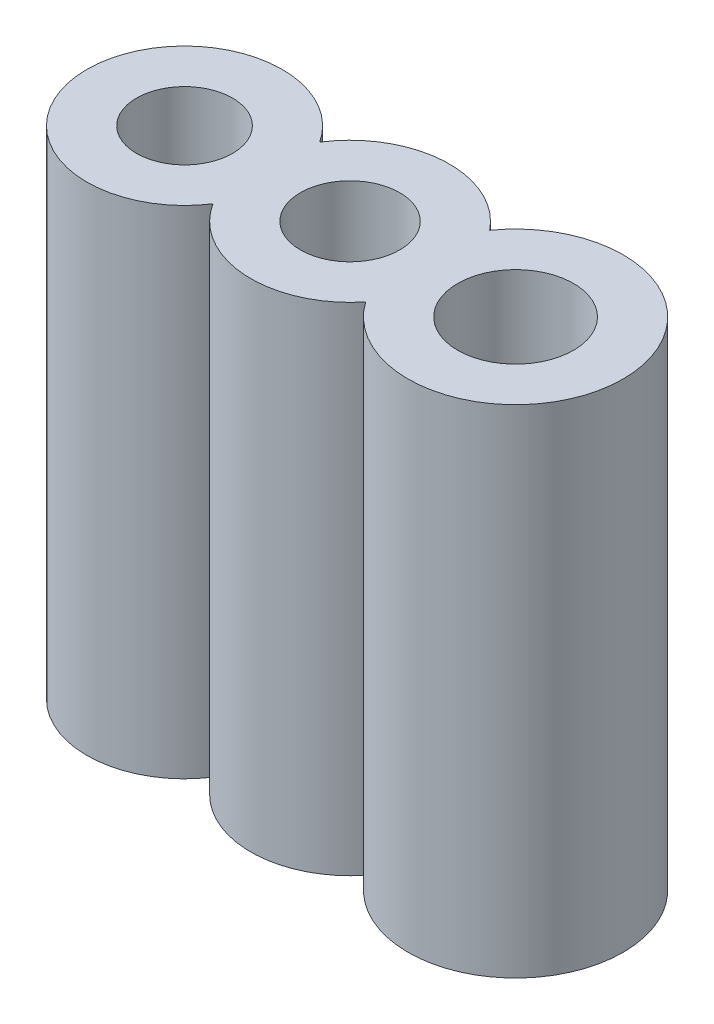
ISO-10303-21;
HEADER;
FILE_DESCRIPTION(('STEP AP214'),'2;1');
FILE_NAME('part.step','',(''),(''),'','','');
FILE_SCHEMA(('AUTOMOTIVE_DESIGN { 1 0 10303 214 1 1 1 1 }'));
ENDSEC;
DATA;
#1=APPLICATION_CONTEXT('core data for automotive mechanical design processes');
#2=APPLICATION_PROTOCOL_DEFINITION('international standard','automotive_design',2000,#1);
#3=PRODUCT_CONTEXT('',#1,'mechanical');
#4=PRODUCT('Part','Part','',(#3));
#5=PRODUCT_RELATED_PRODUCT_CATEGORY('part','',(#4));
#6=PRODUCT_DEFINITION_FORMATION('','',#4);
#7=PRODUCT_DEFINITION_CONTEXT('part definition',#1,'design');
#8=PRODUCT_DEFINITION('design','',#6,#7);
#9=PRODUCT_DEFINITION_SHAPE('','',#8);
#10=(LENGTH_UNIT() NAMED_UNIT(*) SI_UNIT(.MILLI.,.METRE.));
#11=(NAMED_UNIT(*) PLANE_ANGLE_UNIT() SI_UNIT($,.RADIAN.));
#12=(NAMED_UNIT(*) SI_UNIT($,.STERADIAN.) SOLID_ANGLE_UNIT());
#13=UNCERTAINTY_MEASURE_WITH_UNIT(LENGTH_MEASURE(1.E-05),#10,'distance_accuracy_value','');
#14=(GEOMETRIC_REPRESENTATION_CONTEXT(3) GLOBAL_UNCERTAINTY_ASSIGNED_CONTEXT((#13)) GLOBAL_UNIT_ASSIGNED_CONTEXT((#10,
#11,#12)) REPRESENTATION_CONTEXT('',''));
#15=CARTESIAN_POINT('',(0.,0.,0.));
#16=DIRECTION('',(0.,0.,1.));
#17=DIRECTION('',(1.,0.,0.));
#18=AXIS2_PLACEMENT_3D('',#15,#16,#17);
#19=CARTESIAN_POINT('',(-2.5,15.,0.));
#20=DIRECTION('',(0.,1.,0.));
#21=DIRECTION('',(0.,0.,1.));
#22=AXIS2_PLACEMENT_3D('',#19,#20,#21);
#23=PLANE('',#22);
#24=CARTESIAN_POINT('',(5.,15.,0.));
#25=DIRECTION('',(0.,1.,0.));
#26=DIRECTION('',(0.,0.,1.));
#27=AXIS2_PLACEMENT_3D('',#24,#25,#26);
#28=CIRCLE('',#27,1.75);
#29=CARTESIAN_POINT('',(5.,15.,1.75));
#30=VERTEX_POINT('',#29);
#31=EDGE_CURVE('E115',#30,#30,#28,.T.);
#32=ORIENTED_EDGE('',*,*,#31,.F.);
#33=EDGE_LOOP('',(#32));
#34=FACE_BOUND('',#33,.T.);
#35=CARTESIAN_POINT('',(0.,15.,0.));
#36=DIRECTION('',(0.,1.,0.));
#37=DIRECTION('',(0.,0.,1.));
#38=AXIS2_PLACEMENT_3D('',#35,#36,#37);
#39=CIRCLE('',#38,3.);
#40=CARTESIAN_POINT('',(2.34375,15.,-1.87265478332233));
#41=VERTEX_POINT('',#40);
#42=CARTESIAN_POINT('',(-2.52975,15.,-1.61256470800399));
#43=VERTEX_POINT('',#42);
#44=EDGE_CURVE('E85',#41,#43,#39,.T.);
#45=ORIENTED_EDGE('',*,*,#44,.T.);
#46=CARTESIAN_POINT('',(-5.,15.,0.));
#47=DIRECTION('',(0.,1.,0.));
#48=DIRECTION('',(0.,0.,1.));
#49=AXIS2_PLACEMENT_3D('',#46,#47,#48);
#50=CIRCLE('',#49,2.95);
#51=CARTESIAN_POINT('',(-2.52975,15.,1.61256470800399));
#52=VERTEX_POINT('',#51);
#53=EDGE_CURVE('E80',#43,#52,#50,.T.);
#54=ORIENTED_EDGE('',*,*,#53,.T.);
#55=CARTESIAN_POINT('',(0.,15.,0.));
#56=DIRECTION('',(0.,1.,0.));
#57=DIRECTION('',(0.,0.,1.));
#58=AXIS2_PLACEMENT_3D('',#55,#56,#57);
#59=CIRCLE('',#58,3.);
#60=CARTESIAN_POINT('',(2.34375,15.,1.87265478332233));
#61=VERTEX_POINT('',#60);
#62=EDGE_CURVE('E83',#52,#61,#59,.T.);
#63=ORIENTED_EDGE('',*,*,#62,.T.);
#64=CARTESIAN_POINT('',(5.,15.,0.));
#65=DIRECTION('',(0.,1.,0.));
#66=DIRECTION('',(0.,0.,1.));
#67=AXIS2_PLACEMENT_3D('',#64,#65,#66);
#68=CIRCLE('',#67,3.25);
#69=EDGE_CURVE('E50',#61,#41,#68,.T.);
#70=ORIENTED_EDGE('',*,*,#69,.T.);
#71=EDGE_LOOP('',(#45,#54,#63,#70));
#72=FACE_BOUND('',#71,.T.);
#73=CARTESIAN_POINT('',(0.,15.,0.));
#74=DIRECTION('',(0.,1.,0.));
#75=DIRECTION('',(0.,0.,1.));
#76=AXIS2_PLACEMENT_3D('',#73,#74,#75);
#77=CIRCLE('',#76,1.5);
#78=CARTESIAN_POINT('',(0.,15.,1.5));
#79=VERTEX_POINT('',#78);
#80=EDGE_CURVE('E100',#79,#79,#77,.T.);
#81=ORIENTED_EDGE('',*,*,#80,.F.);
#82=EDGE_LOOP('',(#81));
#83=FACE_BOUND('',#82,.T.);
#84=CARTESIAN_POINT('',(-5.,15.,0.));
#85=DIRECTION('',(0.,1.,0.));
#86=DIRECTION('',(0.,0.,1.));
#87=AXIS2_PLACEMENT_3D('',#84,#85,#86);
#88=CIRCLE('',#87,1.45);
#89=CARTESIAN_POINT('',(-5.,15.,1.45));
#90=VERTEX_POINT('',#89);
#91=EDGE_CURVE('E121',#90,#90,#88,.T.);
#92=ORIENTED_EDGE('',*,*,#91,.F.);
#93=EDGE_LOOP('',(#92));
#94=FACE_BOUND('',#93,.T.);
#95=ADVANCED_FACE('F33',(#34,#72,#83,#94),#23,.T.);
#96=CARTESIAN_POINT('',(-2.5,0.,0.));
#97=DIRECTION('',(0.,1.,0.));
#98=DIRECTION('',(0.,0.,1.));
#99=AXIS2_PLACEMENT_3D('',#96,#97,#98);
#100=PLANE('',#99);
#101=CARTESIAN_POINT('',(0.,0.,0.));
#102=DIRECTION('',(0.,1.,0.));
#103=DIRECTION('',(0.,0.,1.));
#104=AXIS2_PLACEMENT_3D('',#101,#102,#103);
#105=CIRCLE('',#104,3.);
#106=CARTESIAN_POINT('',(2.34375,0.,-1.87265478332233));
#107=VERTEX_POINT('',#106);
#108=CARTESIAN_POINT('',(-2.52975,0.,-1.61256470800399));
#109=VERTEX_POINT('',#108);
#110=EDGE_CURVE('E97',#107,#109,#105,.T.);
#111=ORIENTED_EDGE('',*,*,#110,.F.);
#112=CARTESIAN_POINT('',(5.,0.,0.));
#113=DIRECTION('',(0.,1.,0.));
#114=DIRECTION('',(0.,0.,1.));
#115=AXIS2_PLACEMENT_3D('',#112,#113,#114);
#116=CIRCLE('',#115,3.25);
#117=CARTESIAN_POINT('',(2.34375,0.,1.87265478332233));
#118=VERTEX_POINT('',#117);
#119=EDGE_CURVE('E73',#118,#107,#116,.T.);
#120=ORIENTED_EDGE('',*,*,#119,.F.);
#121=CARTESIAN_POINT('',(0.,0.,0.));
#122=DIRECTION('',(0.,1.,0.));
#123=DIRECTION('',(0.,0.,1.));
#124=AXIS2_PLACEMENT_3D('',#121,#122,#123);
#125=CIRCLE('',#124,3.);
#126=CARTESIAN_POINT('',(-2.52975,0.,1.61256470800399));
#127=VERTEX_POINT('',#126);
#128=EDGE_CURVE('E67',#127,#118,#125,.T.);
#129=ORIENTED_EDGE('',*,*,#128,.F.);
#130=CARTESIAN_POINT('',(-5.,0.,0.));
#131=DIRECTION('',(0.,1.,0.));
#132=DIRECTION('',(0.,0.,1.));
#133=AXIS2_PLACEMENT_3D('',#130,#131,#132);
#134=CIRCLE('',#133,2.95);
#135=EDGE_CURVE('E89',#109,#127,#134,.T.);
#136=ORIENTED_EDGE('',*,*,#135,.F.);
#137=EDGE_LOOP('',(#111,#120,#129,#136));
#138=FACE_BOUND('',#137,.T.);
#139=CARTESIAN_POINT('',(0.,0.,0.));
#140=DIRECTION('',(0.,1.,0.));
#141=DIRECTION('',(0.,0.,1.));
#142=AXIS2_PLACEMENT_3D('',#139,#140,#141);
#143=CIRCLE('',#142,1.5);
#144=CARTESIAN_POINT('',(0.,0.,1.5));
#145=VERTEX_POINT('',#144);
#146=EDGE_CURVE('E112',#145,#145,#143,.T.);
#147=ORIENTED_EDGE('',*,*,#146,.T.);
#148=EDGE_LOOP('',(#147));
#149=FACE_BOUND('',#148,.T.);
#150=CARTESIAN_POINT('',(5.,0.,0.));
#151=DIRECTION('',(0.,1.,0.));
#152=DIRECTION('',(0.,0.,1.));
#153=AXIS2_PLACEMENT_3D('',#150,#151,#152);
#154=CIRCLE('',#153,1.75);
#155=CARTESIAN_POINT('',(5.,0.,1.75));
#156=VERTEX_POINT('',#155);
#157=EDGE_CURVE('E118',#156,#156,#154,.T.);
#158=ORIENTED_EDGE('',*,*,#157,.T.);
#159=EDGE_LOOP('',(#158));
#160=FACE_BOUND('',#159,.T.);
#161=CARTESIAN_POINT('',(-5.,0.,0.));
#162=DIRECTION('',(0.,1.,0.));
#163=DIRECTION('',(0.,0.,1.));
#164=AXIS2_PLACEMENT_3D('',#161,#162,#163);
#165=CIRCLE('',#164,1.45);
#166=CARTESIAN_POINT('',(-5.,0.,1.45));
#167=VERTEX_POINT('',#166);
#168=EDGE_CURVE('E124',#167,#167,#165,.T.);
#169=ORIENTED_EDGE('',*,*,#168,.T.);
#170=EDGE_LOOP('',(#169));
#171=FACE_BOUND('',#170,.T.);
#172=ADVANCED_FACE('F108',(#138,#149,#160,#171),#100,.F.);
#173=CARTESIAN_POINT('',(0.,15.,0.));
#174=DIRECTION('',(0.,-1.,0.));
#175=DIRECTION('',(0.,0.,-1.));
#176=AXIS2_PLACEMENT_3D('',#173,#174,#175);
#177=CYLINDRICAL_SURFACE('',#176,3.);
#178=ORIENTED_EDGE('',*,*,#110,.T.);
#179=DIRECTION('',(0.,-1.,0.));
#180=VECTOR('',#179,1.);
#181=CARTESIAN_POINT('',(-2.52975,15.,-1.61256470800399));
#182=LINE('',#181,#180);
#183=EDGE_CURVE('E11',#43,#109,#182,.T.);
#184=ORIENTED_EDGE('',*,*,#183,.F.);
#185=ORIENTED_EDGE('',*,*,#44,.F.);
#186=DIRECTION('',(0.,-1.,0.));
#187=VECTOR('',#186,1.);
#188=CARTESIAN_POINT('',(2.34375,15.,-1.87265478332233));
#189=LINE('',#188,#187);
#190=EDGE_CURVE('E93',#41,#107,#189,.T.);
#191=ORIENTED_EDGE('',*,*,#190,.T.);
#192=EDGE_LOOP('',(#178,#184,#185,#191));
#193=FACE_BOUND('',#192,.T.);
#194=ADVANCED_FACE('F35',(#193),#177,.T.);
#195=CARTESIAN_POINT('',(-5.,15.,0.));
#196=DIRECTION('',(0.,-1.,0.));
#197=DIRECTION('',(0.,0.,-1.));
#198=AXIS2_PLACEMENT_3D('',#195,#196,#197);
#199=CYLINDRICAL_SURFACE('',#198,2.95);
#200=ORIENTED_EDGE('',*,*,#135,.T.);
#201=DIRECTION('',(0.,-1.,0.));
#202=VECTOR('',#201,1.);
#203=CARTESIAN_POINT('',(-2.52975,15.,1.61256470800399));
#204=LINE('',#203,#202);
#205=EDGE_CURVE('E42',#52,#127,#204,.T.);
#206=ORIENTED_EDGE('',*,*,#205,.F.);
#207=ORIENTED_EDGE('',*,*,#53,.F.);
#208=ORIENTED_EDGE('',*,*,#183,.T.);
#209=EDGE_LOOP('',(#200,#206,#207,#208));
#210=FACE_BOUND('',#209,.T.);
#211=ADVANCED_FACE('F88',(#210),#199,.T.);
#212=CARTESIAN_POINT('',(0.,15.,0.));
#213=DIRECTION('',(0.,-1.,0.));
#214=DIRECTION('',(0.,0.,-1.));
#215=AXIS2_PLACEMENT_3D('',#212,#213,#214);
#216=CYLINDRICAL_SURFACE('',#215,3.);
#217=ORIENTED_EDGE('',*,*,#128,.T.);
#218=DIRECTION('',(0.,-1.,0.));
#219=VECTOR('',#218,1.);
#220=CARTESIAN_POINT('',(2.34375,15.,1.87265478332233));
#221=LINE('',#220,#219);
#222=EDGE_CURVE('E90',#61,#118,#221,.T.);
#223=ORIENTED_EDGE('',*,*,#222,.F.);
#224=ORIENTED_EDGE('',*,*,#62,.F.);
#225=ORIENTED_EDGE('',*,*,#205,.T.);
#226=EDGE_LOOP('',(#217,#223,#224,#225));
#227=FACE_BOUND('',#226,.T.);
#228=ADVANCED_FACE('F91',(#227),#216,.T.);
#229=CARTESIAN_POINT('',(5.,15.,0.));
#230=DIRECTION('',(0.,-1.,0.));
#231=DIRECTION('',(0.,0.,-1.));
#232=AXIS2_PLACEMENT_3D('',#229,#230,#231);
#233=CYLINDRICAL_SURFACE('',#232,3.25);
#234=ORIENTED_EDGE('',*,*,#119,.T.);
#235=ORIENTED_EDGE('',*,*,#190,.F.);
#236=ORIENTED_EDGE('',*,*,#69,.F.);
#237=ORIENTED_EDGE('',*,*,#222,.T.);
#238=EDGE_LOOP('',(#234,#235,#236,#237));
#239=FACE_BOUND('',#238,.T.);
#240=ADVANCED_FACE('F105',(#239),#233,.T.);
#241=CARTESIAN_POINT('',(0.,15.,0.));
#242=DIRECTION('',(0.,-1.,0.));
#243=DIRECTION('',(0.,0.,-1.));
#244=AXIS2_PLACEMENT_3D('',#241,#242,#243);
#245=CYLINDRICAL_SURFACE('',#244,1.5);
#246=ORIENTED_EDGE('',*,*,#80,.T.);
#247=EDGE_LOOP('',(#246));
#248=FACE_BOUND('',#247,.T.);
#249=ORIENTED_EDGE('',*,*,#146,.F.);
#250=EDGE_LOOP('',(#249));
#251=FACE_BOUND('',#250,.T.);
#252=ADVANCED_FACE('F142',(#248,#251),#245,.F.);
#253=CARTESIAN_POINT('',(5.,15.,0.));
#254=DIRECTION('',(0.,-1.,0.));
#255=DIRECTION('',(0.,0.,-1.));
#256=AXIS2_PLACEMENT_3D('',#253,#254,#255);
#257=CYLINDRICAL_SURFACE('',#256,1.75);
#258=ORIENTED_EDGE('',*,*,#31,.T.);
#259=EDGE_LOOP('',(#258));
#260=FACE_BOUND('',#259,.T.);
#261=ORIENTED_EDGE('',*,*,#157,.F.);
#262=EDGE_LOOP('',(#261));
#263=FACE_BOUND('',#262,.T.);
#264=ADVANCED_FACE('F188',(#260,#263),#257,.F.);
#265=CARTESIAN_POINT('',(-5.,15.,0.));
#266=DIRECTION('',(0.,-1.,0.));
#267=DIRECTION('',(0.,0.,-1.));
#268=AXIS2_PLACEMENT_3D('',#265,#266,#267);
#269=CYLINDRICAL_SURFACE('',#268,1.45);
#270=ORIENTED_EDGE('',*,*,#91,.T.);
#271=EDGE_LOOP('',(#270));
#272=FACE_BOUND('',#271,.T.);
#273=ORIENTED_EDGE('',*,*,#168,.F.);
#274=EDGE_LOOP('',(#273));
#275=FACE_BOUND('',#274,.T.);
#276=ADVANCED_FACE('F130',(#272,#275),#269,.F.);
#277=CLOSED_SHELL('',(#95,#172,#194,#211,#228,#240,#252,#264,#276));
#278=MANIFOLD_SOLID_BREP('B2',#277);
#279=ADVANCED_BREP_SHAPE_REPRESENTATION('',(#18,#278),#14);
#280=SHAPE_DEFINITION_REPRESENTATION(#9,#279);
ENDSEC;
END-ISO-10303-21;
